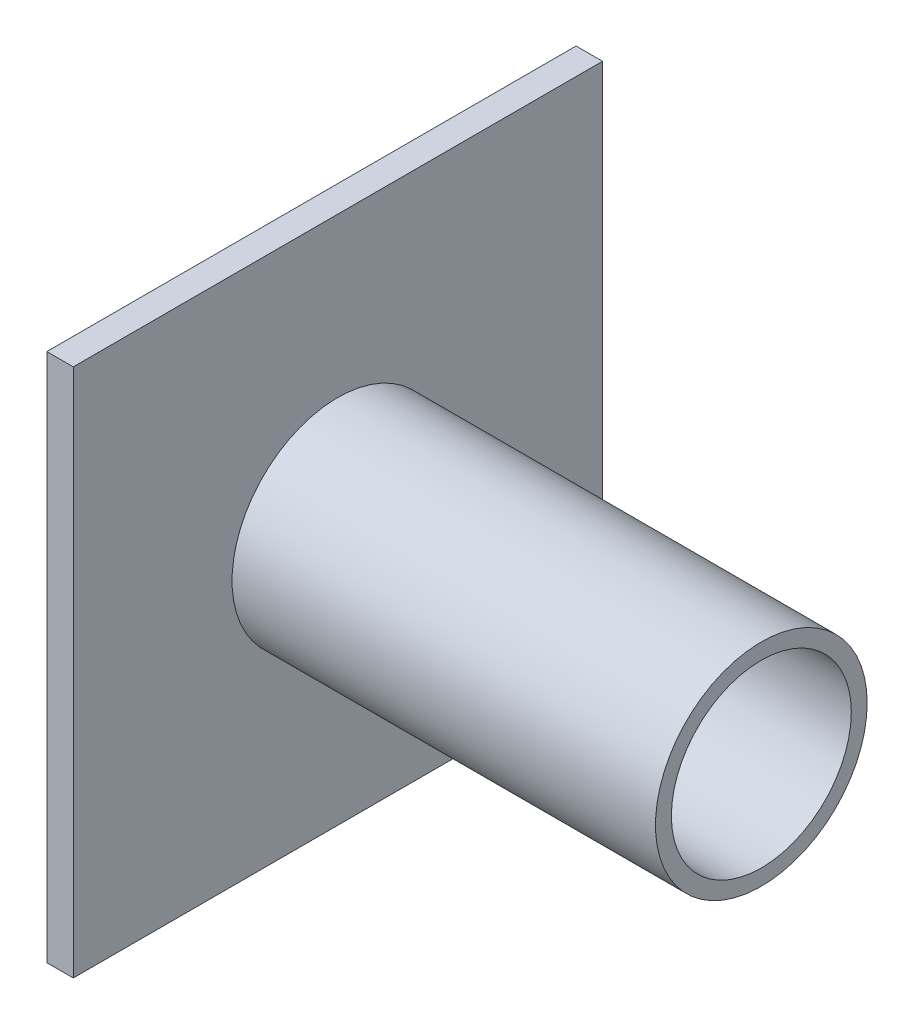
ISO-10303-21;
HEADER;
FILE_DESCRIPTION(('STEP AP214'),'2;1');
FILE_NAME('part.step','',(''),(''),'','','');
FILE_SCHEMA(('AUTOMOTIVE_DESIGN { 1 0 10303 214 1 1 1 1 }'));
ENDSEC;
DATA;
#1=APPLICATION_CONTEXT('core data for automotive mechanical design processes');
#2=APPLICATION_PROTOCOL_DEFINITION('international standard','automotive_design',2000,#1);
#3=PRODUCT_CONTEXT('',#1,'mechanical');
#4=PRODUCT('Part','Part','',(#3));
#5=PRODUCT_RELATED_PRODUCT_CATEGORY('part','',(#4));
#6=PRODUCT_DEFINITION_FORMATION('','',#4);
#7=PRODUCT_DEFINITION_CONTEXT('part definition',#1,'design');
#8=PRODUCT_DEFINITION('design','',#6,#7);
#9=PRODUCT_DEFINITION_SHAPE('','',#8);
#10=(LENGTH_UNIT() NAMED_UNIT(*) SI_UNIT(.MILLI.,.METRE.));
#11=(NAMED_UNIT(*) PLANE_ANGLE_UNIT() SI_UNIT($,.RADIAN.));
#12=(NAMED_UNIT(*) SI_UNIT($,.STERADIAN.) SOLID_ANGLE_UNIT());
#13=UNCERTAINTY_MEASURE_WITH_UNIT(LENGTH_MEASURE(1.E-05),#10,'distance_accuracy_value','');
#14=(GEOMETRIC_REPRESENTATION_CONTEXT(3) GLOBAL_UNCERTAINTY_ASSIGNED_CONTEXT((#13)) GLOBAL_UNIT_ASSIGNED_CONTEXT((#10,
#11,#12)) REPRESENTATION_CONTEXT('',''));
#15=CARTESIAN_POINT('',(0.,0.,0.));
#16=DIRECTION('',(0.,0.,1.));
#17=DIRECTION('',(1.,0.,0.));
#18=AXIS2_PLACEMENT_3D('',#15,#16,#17);
#19=CARTESIAN_POINT('',(5.,-50.,-50.));
#20=DIRECTION('',(0.,0.,1.));
#21=DIRECTION('',(1.,0.,0.));
#22=AXIS2_PLACEMENT_3D('',#19,#20,#21);
#23=PLANE('',#22);
#24=DIRECTION('',(0.,1.,0.));
#25=VECTOR('',#24,1.);
#26=CARTESIAN_POINT('',(0.,-50.,-50.));
#27=LINE('',#26,#25);
#28=CARTESIAN_POINT('',(0.,-50.,-50.));
#29=VERTEX_POINT('',#28);
#30=CARTESIAN_POINT('',(0.,50.,-50.));
#31=VERTEX_POINT('',#30);
#32=EDGE_CURVE('E99',#29,#31,#27,.T.);
#33=ORIENTED_EDGE('',*,*,#32,.T.);
#34=DIRECTION('',(-1.,0.,0.));
#35=VECTOR('',#34,1.);
#36=CARTESIAN_POINT('',(5.,50.,-50.));
#37=LINE('',#36,#35);
#38=CARTESIAN_POINT('',(5.,50.,-50.));
#39=VERTEX_POINT('',#38);
#40=EDGE_CURVE('E36',#39,#31,#37,.T.);
#41=ORIENTED_EDGE('',*,*,#40,.F.);
#42=DIRECTION('',(0.,1.,0.));
#43=VECTOR('',#42,1.);
#44=CARTESIAN_POINT('',(5.,-50.,-50.));
#45=LINE('',#44,#43);
#46=CARTESIAN_POINT('',(5.,-50.,-50.));
#47=VERTEX_POINT('',#46);
#48=EDGE_CURVE('E86',#47,#39,#45,.T.);
#49=ORIENTED_EDGE('',*,*,#48,.F.);
#50=DIRECTION('',(-1.,0.,0.));
#51=VECTOR('',#50,1.);
#52=CARTESIAN_POINT('',(5.,-50.,-50.));
#53=LINE('',#52,#51);
#54=EDGE_CURVE('E95',#47,#29,#53,.T.);
#55=ORIENTED_EDGE('',*,*,#54,.T.);
#56=EDGE_LOOP('',(#33,#41,#49,#55));
#57=FACE_BOUND('',#56,.T.);
#58=ADVANCED_FACE('F33',(#57),#23,.F.);
#59=CARTESIAN_POINT('',(5.,50.,50.));
#60=DIRECTION('',(0.,-1.,0.));
#61=DIRECTION('',(0.,0.,-1.));
#62=AXIS2_PLACEMENT_3D('',#59,#60,#61);
#63=PLANE('',#62);
#64=DIRECTION('',(0.,0.,1.));
#65=VECTOR('',#64,1.);
#66=CARTESIAN_POINT('',(0.,50.,50.));
#67=LINE('',#66,#65);
#68=CARTESIAN_POINT('',(0.,50.,50.));
#69=VERTEX_POINT('',#68);
#70=EDGE_CURVE('E91',#31,#69,#67,.T.);
#71=ORIENTED_EDGE('',*,*,#70,.T.);
#72=DIRECTION('',(-1.,0.,0.));
#73=VECTOR('',#72,1.);
#74=CARTESIAN_POINT('',(5.,50.,50.));
#75=LINE('',#74,#73);
#76=CARTESIAN_POINT('',(5.,50.,50.));
#77=VERTEX_POINT('',#76);
#78=EDGE_CURVE('E89',#77,#69,#75,.T.);
#79=ORIENTED_EDGE('',*,*,#78,.F.);
#80=DIRECTION('',(0.,0.,1.));
#81=VECTOR('',#80,1.);
#82=CARTESIAN_POINT('',(5.,50.,50.));
#83=LINE('',#82,#81);
#84=EDGE_CURVE('E81',#39,#77,#83,.T.);
#85=ORIENTED_EDGE('',*,*,#84,.F.);
#86=ORIENTED_EDGE('',*,*,#40,.T.);
#87=EDGE_LOOP('',(#71,#79,#85,#86));
#88=FACE_BOUND('',#87,.T.);
#89=ADVANCED_FACE('F90',(#88),#63,.F.);
#90=CARTESIAN_POINT('',(5.,-50.,50.));
#91=DIRECTION('',(0.,0.,-1.));
#92=DIRECTION('',(-1.,0.,0.));
#93=AXIS2_PLACEMENT_3D('',#90,#91,#92);
#94=PLANE('',#93);
#95=DIRECTION('',(0.,-1.,0.));
#96=VECTOR('',#95,1.);
#97=CARTESIAN_POINT('',(0.,-50.,50.));
#98=LINE('',#97,#96);
#99=CARTESIAN_POINT('',(0.,-50.,50.));
#100=VERTEX_POINT('',#99);
#101=EDGE_CURVE('E67',#69,#100,#98,.T.);
#102=ORIENTED_EDGE('',*,*,#101,.T.);
#103=DIRECTION('',(-1.,0.,0.));
#104=VECTOR('',#103,1.);
#105=CARTESIAN_POINT('',(5.,-50.,50.));
#106=LINE('',#105,#104);
#107=CARTESIAN_POINT('',(5.,-50.,50.));
#108=VERTEX_POINT('',#107);
#109=EDGE_CURVE('E92',#108,#100,#106,.T.);
#110=ORIENTED_EDGE('',*,*,#109,.F.);
#111=DIRECTION('',(0.,-1.,0.));
#112=VECTOR('',#111,1.);
#113=CARTESIAN_POINT('',(5.,-50.,50.));
#114=LINE('',#113,#112);
#115=EDGE_CURVE('E84',#77,#108,#114,.T.);
#116=ORIENTED_EDGE('',*,*,#115,.F.);
#117=ORIENTED_EDGE('',*,*,#78,.T.);
#118=EDGE_LOOP('',(#102,#110,#116,#117));
#119=FACE_BOUND('',#118,.T.);
#120=ADVANCED_FACE('F93',(#119),#94,.F.);
#121=CARTESIAN_POINT('',(5.,-50.,50.));
#122=DIRECTION('',(0.,1.,0.));
#123=DIRECTION('',(0.,0.,1.));
#124=AXIS2_PLACEMENT_3D('',#121,#122,#123);
#125=PLANE('',#124);
#126=DIRECTION('',(0.,0.,-1.));
#127=VECTOR('',#126,1.);
#128=CARTESIAN_POINT('',(0.,-50.,50.));
#129=LINE('',#128,#127);
#130=EDGE_CURVE('E73',#100,#29,#129,.T.);
#131=ORIENTED_EDGE('',*,*,#130,.T.);
#132=ORIENTED_EDGE('',*,*,#54,.F.);
#133=DIRECTION('',(0.,0.,-1.));
#134=VECTOR('',#133,1.);
#135=CARTESIAN_POINT('',(5.,-50.,50.));
#136=LINE('',#135,#134);
#137=EDGE_CURVE('E50',#108,#47,#136,.T.);
#138=ORIENTED_EDGE('',*,*,#137,.F.);
#139=ORIENTED_EDGE('',*,*,#109,.T.);
#140=EDGE_LOOP('',(#131,#132,#138,#139));
#141=FACE_BOUND('',#140,.T.);
#142=ADVANCED_FACE('F107',(#141),#125,.F.);
#143=CARTESIAN_POINT('',(5.,0.,0.));
#144=DIRECTION('',(-1.,0.,0.));
#145=DIRECTION('',(0.,0.,1.));
#146=AXIS2_PLACEMENT_3D('',#143,#144,#145);
#147=PLANE('',#146);
#148=CARTESIAN_POINT('',(5.,0.,0.));
#149=DIRECTION('',(1.,0.,0.));
#150=DIRECTION('',(0.,0.,-1.));
#151=AXIS2_PLACEMENT_3D('',#148,#149,#150);
#152=CIRCLE('',#151,20.);
#153=CARTESIAN_POINT('',(5.,0.,-20.));
#154=VERTEX_POINT('',#153);
#155=EDGE_CURVE('E11',#154,#154,#152,.T.);
#156=ORIENTED_EDGE('',*,*,#155,.F.);
#157=EDGE_LOOP('',(#156));
#158=FACE_BOUND('',#157,.T.);
#159=ORIENTED_EDGE('',*,*,#48,.T.);
#160=ORIENTED_EDGE('',*,*,#84,.T.);
#161=ORIENTED_EDGE('',*,*,#115,.T.);
#162=ORIENTED_EDGE('',*,*,#137,.T.);
#163=EDGE_LOOP('',(#159,#160,#161,#162));
#164=FACE_BOUND('',#163,.T.);
#165=ADVANCED_FACE('F82',(#158,#164),#147,.F.);
#166=CARTESIAN_POINT('',(0.,0.,0.));
#167=DIRECTION('',(-1.,0.,0.));
#168=DIRECTION('',(0.,0.,1.));
#169=AXIS2_PLACEMENT_3D('',#166,#167,#168);
#170=PLANE('',#169);
#171=ORIENTED_EDGE('',*,*,#32,.F.);
#172=ORIENTED_EDGE('',*,*,#130,.F.);
#173=ORIENTED_EDGE('',*,*,#101,.F.);
#174=ORIENTED_EDGE('',*,*,#70,.F.);
#175=EDGE_LOOP('',(#171,#172,#173,#174));
#176=FACE_BOUND('',#175,.T.);
#177=ADVANCED_FACE('F110',(#176),#170,.T.);
#178=CARTESIAN_POINT('',(85.,0.,0.));
#179=DIRECTION('',(-1.,0.,0.));
#180=DIRECTION('',(0.,0.,1.));
#181=AXIS2_PLACEMENT_3D('',#178,#179,#180);
#182=CYLINDRICAL_SURFACE('',#181,20.);
#183=CARTESIAN_POINT('',(85.,0.,0.));
#184=DIRECTION('',(1.,0.,0.));
#185=DIRECTION('',(0.,0.,-1.));
#186=AXIS2_PLACEMENT_3D('',#183,#184,#185);
#187=CIRCLE('',#186,20.);
#188=CARTESIAN_POINT('',(85.,0.,-20.));
#189=VERTEX_POINT('',#188);
#190=EDGE_CURVE('E102',#189,#189,#187,.T.);
#191=ORIENTED_EDGE('',*,*,#190,.F.);
#192=EDGE_LOOP('',(#191));
#193=FACE_BOUND('',#192,.T.);
#194=ORIENTED_EDGE('',*,*,#155,.T.);
#195=EDGE_LOOP('',(#194));
#196=FACE_BOUND('',#195,.T.);
#197=ADVANCED_FACE('F128',(#193,#196),#182,.T.);
#198=CARTESIAN_POINT('',(85.,0.,0.));
#199=DIRECTION('',(1.,0.,0.));
#200=DIRECTION('',(0.,0.,-1.));
#201=AXIS2_PLACEMENT_3D('',#198,#199,#200);
#202=PLANE('',#201);
#203=CARTESIAN_POINT('',(85.,0.,0.));
#204=DIRECTION('',(1.,0.,0.));
#205=DIRECTION('',(0.,0.,-1.));
#206=AXIS2_PLACEMENT_3D('',#203,#204,#205);
#207=CIRCLE('',#206,17.);
#208=CARTESIAN_POINT('',(85.,0.,-17.));
#209=VERTEX_POINT('',#208);
#210=EDGE_CURVE('E118',#209,#209,#207,.T.);
#211=ORIENTED_EDGE('',*,*,#210,.F.);
#212=EDGE_LOOP('',(#211));
#213=FACE_BOUND('',#212,.T.);
#214=ORIENTED_EDGE('',*,*,#190,.T.);
#215=EDGE_LOOP('',(#214));
#216=FACE_BOUND('',#215,.T.);
#217=ADVANCED_FACE('F125',(#213,#216),#202,.T.);
#218=CARTESIAN_POINT('',(85.,0.,0.));
#219=DIRECTION('',(-1.,0.,0.));
#220=DIRECTION('',(0.,0.,1.));
#221=AXIS2_PLACEMENT_3D('',#218,#219,#220);
#222=CYLINDRICAL_SURFACE('',#221,17.);
#223=ORIENTED_EDGE('',*,*,#210,.T.);
#224=EDGE_LOOP('',(#223));
#225=FACE_BOUND('',#224,.T.);
#226=CARTESIAN_POINT('',(3.,0.,0.));
#227=DIRECTION('',(-1.,0.,0.));
#228=DIRECTION('',(0.,0.,1.));
#229=AXIS2_PLACEMENT_3D('',#226,#227,#228);
#230=CIRCLE('',#229,17.);
#231=CARTESIAN_POINT('',(3.,0.,17.));
#232=VERTEX_POINT('',#231);
#233=EDGE_CURVE('E115',#232,#232,#230,.F.);
#234=ORIENTED_EDGE('',*,*,#233,.F.);
#235=EDGE_LOOP('',(#234));
#236=FACE_BOUND('',#235,.T.);
#237=ADVANCED_FACE('F122',(#225,#236),#222,.F.);
#238=CARTESIAN_POINT('',(3.,0.,0.));
#239=DIRECTION('',(-1.,0.,0.));
#240=DIRECTION('',(0.,0.,1.));
#241=AXIS2_PLACEMENT_3D('',#238,#239,#240);
#242=PLANE('',#241);
#243=ORIENTED_EDGE('',*,*,#233,.T.);
#244=EDGE_LOOP('',(#243));
#245=FACE_BOUND('',#244,.T.);
#246=ADVANCED_FACE('F191',(#245),#242,.F.);
#247=CLOSED_SHELL('',(#58,#89,#120,#142,#165,#177,#197,#217,#237,#246));
#248=MANIFOLD_SOLID_BREP('B2',#247);
#249=ADVANCED_BREP_SHAPE_REPRESENTATION('',(#18,#248),#14);
#250=SHAPE_DEFINITION_REPRESENTATION(#9,#249);
ENDSEC;
END-ISO-10303-21;
